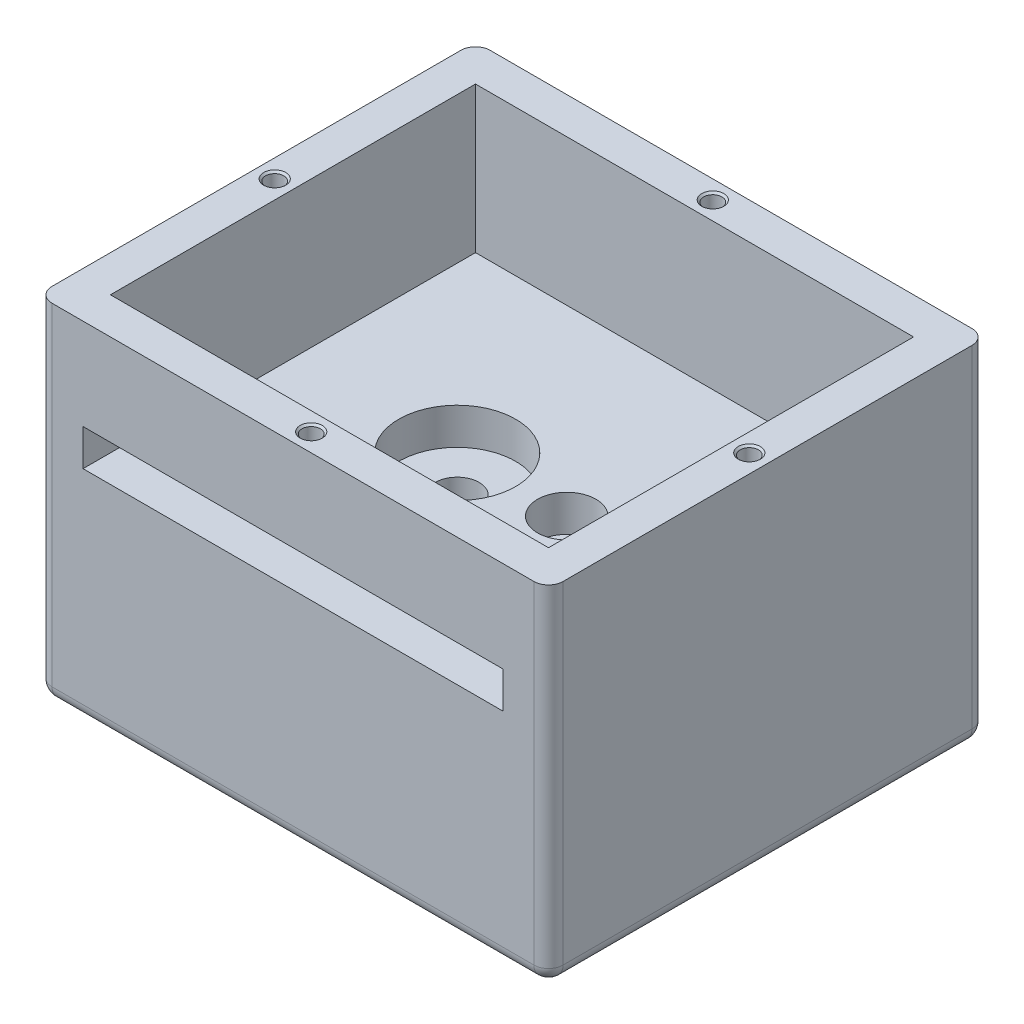
ISO-10303-21;
HEADER;
FILE_DESCRIPTION(('STEP AP214'),'2;1');
FILE_NAME('part.step','',(''),(''),'','','');
FILE_SCHEMA(('AUTOMOTIVE_DESIGN { 1 0 10303 214 1 1 1 1 }'));
ENDSEC;
DATA;
#1=APPLICATION_CONTEXT('core data for automotive mechanical design processes');
#2=APPLICATION_PROTOCOL_DEFINITION('international standard','automotive_design',2000,#1);
#3=PRODUCT_CONTEXT('',#1,'mechanical');
#4=PRODUCT('Part','Part','',(#3));
#5=PRODUCT_RELATED_PRODUCT_CATEGORY('part','',(#4));
#6=PRODUCT_DEFINITION_FORMATION('','',#4);
#7=PRODUCT_DEFINITION_CONTEXT('part definition',#1,'design');
#8=PRODUCT_DEFINITION('design','',#6,#7);
#9=PRODUCT_DEFINITION_SHAPE('','',#8);
#10=(LENGTH_UNIT() NAMED_UNIT(*) SI_UNIT(.MILLI.,.METRE.));
#11=(NAMED_UNIT(*) PLANE_ANGLE_UNIT() SI_UNIT($,.RADIAN.));
#12=(NAMED_UNIT(*) SI_UNIT($,.STERADIAN.) SOLID_ANGLE_UNIT());
#13=UNCERTAINTY_MEASURE_WITH_UNIT(LENGTH_MEASURE(1.E-05),#10,'distance_accuracy_value','');
#14=(GEOMETRIC_REPRESENTATION_CONTEXT(3) GLOBAL_UNCERTAINTY_ASSIGNED_CONTEXT((#13)) GLOBAL_UNIT_ASSIGNED_CONTEXT((#10,
#11,#12)) REPRESENTATION_CONTEXT('',''));
#15=CARTESIAN_POINT('',(0.,0.,0.));
#16=DIRECTION('',(0.,0.,1.));
#17=DIRECTION('',(1.,0.,0.));
#18=AXIS2_PLACEMENT_3D('',#15,#16,#17);
#19=CARTESIAN_POINT('',(0.,40.,0.));
#20=DIRECTION('',(0.,1.,0.));
#21=DIRECTION('',(0.,0.,1.));
#22=AXIS2_PLACEMENT_3D('',#19,#20,#21);
#23=PLANE('',#22);
#24=CARTESIAN_POINT('',(-15.,40.,0.));
#25=DIRECTION('',(0.,1.,0.));
#26=DIRECTION('',(0.,0.,1.));
#27=AXIS2_PLACEMENT_3D('',#24,#25,#26);
#28=CIRCLE('',#27,16.);
#29=CARTESIAN_POINT('',(-15.,40.,16.));
#30=VERTEX_POINT('',#29);
#31=EDGE_CURVE('E227',#30,#30,#28,.T.);
#32=ORIENTED_EDGE('',*,*,#31,.F.);
#33=EDGE_LOOP('',(#32));
#34=FACE_BOUND('',#33,.T.);
#35=CARTESIAN_POINT('',(15.,40.,0.));
#36=DIRECTION('',(0.,1.,0.));
#37=DIRECTION('',(0.,0.,-1.));
#38=AXIS2_PLACEMENT_3D('',#35,#36,#37);
#39=CIRCLE('',#38,8.);
#40=CARTESIAN_POINT('',(15.,40.,-8.));
#41=VERTEX_POINT('',#40);
#42=EDGE_CURVE('E222',#41,#41,#39,.T.);
#43=ORIENTED_EDGE('',*,*,#42,.F.);
#44=EDGE_LOOP('',(#43));
#45=FACE_BOUND('',#44,.T.);
#46=DIRECTION('',(0.,0.,1.));
#47=VECTOR('',#46,1.);
#48=CARTESIAN_POINT('',(-60.,40.,-50.));
#49=LINE('',#48,#47);
#50=CARTESIAN_POINT('',(-60.,40.,-50.));
#51=VERTEX_POINT('',#50);
#52=CARTESIAN_POINT('',(-60.,40.,50.));
#53=VERTEX_POINT('',#52);
#54=EDGE_CURVE('E275',#51,#53,#49,.T.);
#55=ORIENTED_EDGE('',*,*,#54,.T.);
#56=DIRECTION('',(1.,0.,0.));
#57=VECTOR('',#56,1.);
#58=CARTESIAN_POINT('',(-60.,40.,50.));
#59=LINE('',#58,#57);
#60=CARTESIAN_POINT('',(60.,40.,50.));
#61=VERTEX_POINT('',#60);
#62=EDGE_CURVE('E278',#53,#61,#59,.T.);
#63=ORIENTED_EDGE('',*,*,#62,.T.);
#64=DIRECTION('',(0.,0.,-1.));
#65=VECTOR('',#64,1.);
#66=CARTESIAN_POINT('',(60.,40.,-50.));
#67=LINE('',#66,#65);
#68=CARTESIAN_POINT('',(60.,40.,-50.));
#69=VERTEX_POINT('',#68);
#70=EDGE_CURVE('E282',#61,#69,#67,.T.);
#71=ORIENTED_EDGE('',*,*,#70,.T.);
#72=DIRECTION('',(-1.,0.,0.));
#73=VECTOR('',#72,1.);
#74=CARTESIAN_POINT('',(-60.,40.,-50.));
#75=LINE('',#74,#73);
#76=EDGE_CURVE('E285',#69,#51,#75,.T.);
#77=ORIENTED_EDGE('',*,*,#76,.T.);
#78=EDGE_LOOP('',(#55,#63,#71,#77));
#79=FACE_BOUND('',#78,.T.);
#80=ADVANCED_FACE('F43',(#34,#45,#79),#23,.T.);
#81=CARTESIAN_POINT('',(-70.,-15.,60.));
#82=DIRECTION('',(-1.,0.,0.));
#83=DIRECTION('',(0.,0.,1.));
#84=AXIS2_PLACEMENT_3D('',#81,#82,#83);
#85=PLANE('',#84);
#86=DIRECTION('',(0.,0.,1.));
#87=VECTOR('',#86,1.);
#88=CARTESIAN_POINT('',(-70.,80.,60.));
#89=LINE('',#88,#87);
#90=CARTESIAN_POINT('',(-70.,80.,-56.));
#91=VERTEX_POINT('',#90);
#92=CARTESIAN_POINT('',(-70.,80.,56.));
#93=VERTEX_POINT('',#92);
#94=EDGE_CURVE('E300',#91,#93,#89,.T.);
#95=ORIENTED_EDGE('',*,*,#94,.F.);
#96=DIRECTION('',(0.,1.,0.));
#97=VECTOR('',#96,1.);
#98=CARTESIAN_POINT('',(-70.,-15.,-56.));
#99=LINE('',#98,#97);
#100=CARTESIAN_POINT('',(-70.,-11.,-56.));
#101=VERTEX_POINT('',#100);
#102=EDGE_CURVE('E327',#91,#101,#99,.F.);
#103=ORIENTED_EDGE('',*,*,#102,.T.);
#104=DIRECTION('',(0.,0.,1.));
#105=VECTOR('',#104,1.);
#106=CARTESIAN_POINT('',(-70.,-11.,60.));
#107=LINE('',#106,#105);
#108=CARTESIAN_POINT('',(-70.,-11.,56.));
#109=VERTEX_POINT('',#108);
#110=EDGE_CURVE('E324',#101,#109,#107,.T.);
#111=ORIENTED_EDGE('',*,*,#110,.T.);
#112=DIRECTION('',(0.,1.,0.));
#113=VECTOR('',#112,1.);
#114=CARTESIAN_POINT('',(-70.,-15.,56.));
#115=LINE('',#114,#113);
#116=EDGE_CURVE('E318',#109,#93,#115,.T.);
#117=ORIENTED_EDGE('',*,*,#116,.T.);
#118=EDGE_LOOP('',(#95,#103,#111,#117));
#119=FACE_BOUND('',#118,.T.);
#120=ADVANCED_FACE('F428',(#119),#85,.T.);
#121=CARTESIAN_POINT('',(-70.,-15.,-60.));
#122=DIRECTION('',(0.,0.,-1.));
#123=DIRECTION('',(-1.,0.,0.));
#124=AXIS2_PLACEMENT_3D('',#121,#122,#123);
#125=PLANE('',#124);
#126=DIRECTION('',(-1.,0.,0.));
#127=VECTOR('',#126,1.);
#128=CARTESIAN_POINT('',(-70.,-11.,-60.));
#129=LINE('',#128,#127);
#130=CARTESIAN_POINT('',(66.,-11.,-60.));
#131=VERTEX_POINT('',#130);
#132=CARTESIAN_POINT('',(-66.,-11.,-60.));
#133=VERTEX_POINT('',#132);
#134=EDGE_CURVE('E340',#131,#133,#129,.T.);
#135=ORIENTED_EDGE('',*,*,#134,.T.);
#136=DIRECTION('',(0.,1.,0.));
#137=VECTOR('',#136,1.);
#138=CARTESIAN_POINT('',(-66.,-15.,-60.));
#139=LINE('',#138,#137);
#140=CARTESIAN_POINT('',(-66.,80.,-60.));
#141=VERTEX_POINT('',#140);
#142=EDGE_CURVE('E342',#133,#141,#139,.T.);
#143=ORIENTED_EDGE('',*,*,#142,.T.);
#144=DIRECTION('',(-1.,0.,0.));
#145=VECTOR('',#144,1.);
#146=CARTESIAN_POINT('',(-70.,80.,-60.));
#147=LINE('',#146,#145);
#148=CARTESIAN_POINT('',(66.,80.,-60.));
#149=VERTEX_POINT('',#148);
#150=EDGE_CURVE('E315',#149,#141,#147,.T.);
#151=ORIENTED_EDGE('',*,*,#150,.F.);
#152=DIRECTION('',(0.,1.,0.));
#153=VECTOR('',#152,1.);
#154=CARTESIAN_POINT('',(66.,-15.,-60.));
#155=LINE('',#154,#153);
#156=EDGE_CURVE('E338',#149,#131,#155,.F.);
#157=ORIENTED_EDGE('',*,*,#156,.T.);
#158=EDGE_LOOP('',(#135,#143,#151,#157));
#159=FACE_BOUND('',#158,.T.);
#160=ADVANCED_FACE('F479',(#159),#125,.T.);
#161=CARTESIAN_POINT('',(70.,-15.,60.));
#162=DIRECTION('',(1.,0.,0.));
#163=DIRECTION('',(0.,0.,-1.));
#164=AXIS2_PLACEMENT_3D('',#161,#162,#163);
#165=PLANE('',#164);
#166=DIRECTION('',(0.,0.,-1.));
#167=VECTOR('',#166,1.);
#168=CARTESIAN_POINT('',(70.,-11.,60.));
#169=LINE('',#168,#167);
#170=CARTESIAN_POINT('',(70.,-11.,56.));
#171=VERTEX_POINT('',#170);
#172=CARTESIAN_POINT('',(70.,-11.,-56.));
#173=VERTEX_POINT('',#172);
#174=EDGE_CURVE('E60',#171,#173,#169,.T.);
#175=ORIENTED_EDGE('',*,*,#174,.T.);
#176=DIRECTION('',(0.,1.,0.));
#177=VECTOR('',#176,1.);
#178=CARTESIAN_POINT('',(70.,-15.,-56.));
#179=LINE('',#178,#177);
#180=CARTESIAN_POINT('',(70.,80.,-56.));
#181=VERTEX_POINT('',#180);
#182=EDGE_CURVE('E352',#173,#181,#179,.T.);
#183=ORIENTED_EDGE('',*,*,#182,.T.);
#184=DIRECTION('',(0.,0.,-1.));
#185=VECTOR('',#184,1.);
#186=CARTESIAN_POINT('',(70.,80.,60.));
#187=LINE('',#186,#185);
#188=CARTESIAN_POINT('',(70.,80.,56.));
#189=VERTEX_POINT('',#188);
#190=EDGE_CURVE('E312',#189,#181,#187,.T.);
#191=ORIENTED_EDGE('',*,*,#190,.F.);
#192=DIRECTION('',(0.,1.,0.));
#193=VECTOR('',#192,1.);
#194=CARTESIAN_POINT('',(70.,-15.,56.));
#195=LINE('',#194,#193);
#196=EDGE_CURVE('E65',#189,#171,#195,.F.);
#197=ORIENTED_EDGE('',*,*,#196,.T.);
#198=EDGE_LOOP('',(#175,#183,#191,#197));
#199=FACE_BOUND('',#198,.T.);
#200=ADVANCED_FACE('F454',(#199),#165,.T.);
#201=CARTESIAN_POINT('',(-70.,-15.,60.));
#202=DIRECTION('',(0.,0.,1.));
#203=DIRECTION('',(1.,0.,0.));
#204=AXIS2_PLACEMENT_3D('',#201,#202,#203);
#205=PLANE('',#204);
#206=DIRECTION('',(0.,-1.,0.));
#207=VECTOR('',#206,1.);
#208=CARTESIAN_POINT('',(-57.5000000000002,55.,60.));
#209=LINE('',#208,#207);
#210=CARTESIAN_POINT('',(-57.5000000000002,55.,60.));
#211=VERTEX_POINT('',#210);
#212=CARTESIAN_POINT('',(-57.5000000000002,45.,60.));
#213=VERTEX_POINT('',#212);
#214=EDGE_CURVE('E238',#211,#213,#209,.T.);
#215=ORIENTED_EDGE('',*,*,#214,.F.);
#216=DIRECTION('',(-1.,0.,0.));
#217=VECTOR('',#216,1.);
#218=CARTESIAN_POINT('',(-57.5000000000002,55.,60.));
#219=LINE('',#218,#217);
#220=CARTESIAN_POINT('',(57.4999999999998,55.,60.));
#221=VERTEX_POINT('',#220);
#222=EDGE_CURVE('E247',#221,#211,#219,.T.);
#223=ORIENTED_EDGE('',*,*,#222,.F.);
#224=DIRECTION('',(0.,1.,0.));
#225=VECTOR('',#224,1.);
#226=CARTESIAN_POINT('',(57.4999999999998,55.,60.));
#227=LINE('',#226,#225);
#228=CARTESIAN_POINT('',(57.4999999999998,45.,60.));
#229=VERTEX_POINT('',#228);
#230=EDGE_CURVE('E261',#229,#221,#227,.T.);
#231=ORIENTED_EDGE('',*,*,#230,.F.);
#232=DIRECTION('',(1.,0.,0.));
#233=VECTOR('',#232,1.);
#234=CARTESIAN_POINT('',(-57.5000000000002,45.,60.));
#235=LINE('',#234,#233);
#236=EDGE_CURVE('E258',#213,#229,#235,.T.);
#237=ORIENTED_EDGE('',*,*,#236,.F.);
#238=EDGE_LOOP('',(#215,#223,#231,#237));
#239=FACE_BOUND('',#238,.T.);
#240=DIRECTION('',(1.,0.,0.));
#241=VECTOR('',#240,1.);
#242=CARTESIAN_POINT('',(-70.,-11.,60.));
#243=LINE('',#242,#241);
#244=CARTESIAN_POINT('',(-66.,-11.,60.));
#245=VERTEX_POINT('',#244);
#246=CARTESIAN_POINT('',(66.,-11.,60.));
#247=VERTEX_POINT('',#246);
#248=EDGE_CURVE('E346',#245,#247,#243,.T.);
#249=ORIENTED_EDGE('',*,*,#248,.T.);
#250=DIRECTION('',(0.,1.,0.));
#251=VECTOR('',#250,1.);
#252=CARTESIAN_POINT('',(66.,-15.,60.));
#253=LINE('',#252,#251);
#254=CARTESIAN_POINT('',(66.,80.,60.));
#255=VERTEX_POINT('',#254);
#256=EDGE_CURVE('E348',#247,#255,#253,.T.);
#257=ORIENTED_EDGE('',*,*,#256,.T.);
#258=DIRECTION('',(1.,0.,0.));
#259=VECTOR('',#258,1.);
#260=CARTESIAN_POINT('',(-70.,80.,60.));
#261=LINE('',#260,#259);
#262=CARTESIAN_POINT('',(-66.,80.,60.));
#263=VERTEX_POINT('',#262);
#264=EDGE_CURVE('E309',#263,#255,#261,.T.);
#265=ORIENTED_EDGE('',*,*,#264,.F.);
#266=DIRECTION('',(0.,1.,0.));
#267=VECTOR('',#266,1.);
#268=CARTESIAN_POINT('',(-66.,-15.,60.));
#269=LINE('',#268,#267);
#270=EDGE_CURVE('E344',#263,#245,#269,.F.);
#271=ORIENTED_EDGE('',*,*,#270,.T.);
#272=EDGE_LOOP('',(#249,#257,#265,#271));
#273=FACE_BOUND('',#272,.T.);
#274=ADVANCED_FACE('F439',(#239,#273),#205,.T.);
#275=CARTESIAN_POINT('',(0.,-15.,0.));
#276=DIRECTION('',(0.,-1.,0.));
#277=DIRECTION('',(0.,0.,-1.));
#278=AXIS2_PLACEMENT_3D('',#275,#276,#277);
#279=PLANE('',#278);
#280=DIRECTION('',(1.,0.,0.));
#281=VECTOR('',#280,1.);
#282=CARTESIAN_POINT('',(0.,-15.,56.));
#283=LINE('',#282,#281);
#284=CARTESIAN_POINT('',(66.,-15.,56.));
#285=VERTEX_POINT('',#284);
#286=CARTESIAN_POINT('',(-66.,-15.,56.));
#287=VERTEX_POINT('',#286);
#288=EDGE_CURVE('E331',#285,#287,#283,.F.);
#289=ORIENTED_EDGE('',*,*,#288,.T.);
#290=DIRECTION('',(0.,0.,1.));
#291=VECTOR('',#290,1.);
#292=CARTESIAN_POINT('',(-66.,-15.,0.));
#293=LINE('',#292,#291);
#294=CARTESIAN_POINT('',(-66.,-15.,-56.));
#295=VERTEX_POINT('',#294);
#296=EDGE_CURVE('E335',#287,#295,#293,.F.);
#297=ORIENTED_EDGE('',*,*,#296,.T.);
#298=DIRECTION('',(-1.,0.,0.));
#299=VECTOR('',#298,1.);
#300=CARTESIAN_POINT('',(0.,-15.,-56.));
#301=LINE('',#300,#299);
#302=CARTESIAN_POINT('',(66.,-15.,-56.));
#303=VERTEX_POINT('',#302);
#304=EDGE_CURVE('E333',#295,#303,#301,.F.);
#305=ORIENTED_EDGE('',*,*,#304,.T.);
#306=DIRECTION('',(0.,0.,-1.));
#307=VECTOR('',#306,1.);
#308=CARTESIAN_POINT('',(66.,-15.,0.));
#309=LINE('',#308,#307);
#310=EDGE_CURVE('E329',#303,#285,#309,.F.);
#311=ORIENTED_EDGE('',*,*,#310,.T.);
#312=EDGE_LOOP('',(#289,#297,#305,#311));
#313=FACE_BOUND('',#312,.T.);
#314=ADVANCED_FACE('F402',(#313),#279,.T.);
#315=CARTESIAN_POINT('',(0.,80.,0.));
#316=DIRECTION('',(0.,-1.,0.));
#317=DIRECTION('',(0.,0.,-1.));
#318=AXIS2_PLACEMENT_3D('',#315,#316,#317);
#319=PLANE('',#318);
#320=CARTESIAN_POINT('',(65.,80.,0.));
#321=DIRECTION('',(0.,1.,0.));
#322=DIRECTION('',(0.,0.,1.));
#323=AXIS2_PLACEMENT_3D('',#320,#321,#322);
#324=CIRCLE('',#323,3.025);
#325=CARTESIAN_POINT('',(65.,80.,3.025));
#326=VERTEX_POINT('',#325);
#327=EDGE_CURVE('E195',#326,#326,#324,.T.);
#328=ORIENTED_EDGE('',*,*,#327,.F.);
#329=EDGE_LOOP('',(#328));
#330=FACE_BOUND('',#329,.T.);
#331=CARTESIAN_POINT('',(0.,80.,55.));
#332=DIRECTION('',(0.,1.,0.));
#333=DIRECTION('',(0.,0.,1.));
#334=AXIS2_PLACEMENT_3D('',#331,#332,#333);
#335=CIRCLE('',#334,3.025);
#336=CARTESIAN_POINT('',(0.,80.,58.025));
#337=VERTEX_POINT('',#336);
#338=EDGE_CURVE('E188',#337,#337,#335,.T.);
#339=ORIENTED_EDGE('',*,*,#338,.F.);
#340=EDGE_LOOP('',(#339));
#341=FACE_BOUND('',#340,.T.);
#342=CARTESIAN_POINT('',(0.,80.,-55.));
#343=DIRECTION('',(0.,1.,0.));
#344=DIRECTION('',(0.,0.,1.));
#345=AXIS2_PLACEMENT_3D('',#342,#343,#344);
#346=CIRCLE('',#345,3.025);
#347=CARTESIAN_POINT('',(0.,80.,-51.975));
#348=VERTEX_POINT('',#347);
#349=EDGE_CURVE('E204',#348,#348,#346,.T.);
#350=ORIENTED_EDGE('',*,*,#349,.F.);
#351=EDGE_LOOP('',(#350));
#352=FACE_BOUND('',#351,.T.);
#353=CARTESIAN_POINT('',(-65.,80.,0.));
#354=DIRECTION('',(0.,1.,0.));
#355=DIRECTION('',(0.,0.,1.));
#356=AXIS2_PLACEMENT_3D('',#353,#354,#355);
#357=CIRCLE('',#356,3.025);
#358=CARTESIAN_POINT('',(-65.,80.,3.025));
#359=VERTEX_POINT('',#358);
#360=EDGE_CURVE('E213',#359,#359,#357,.T.);
#361=ORIENTED_EDGE('',*,*,#360,.F.);
#362=EDGE_LOOP('',(#361));
#363=FACE_BOUND('',#362,.T.);
#364=DIRECTION('',(1.,0.,0.));
#365=VECTOR('',#364,1.);
#366=CARTESIAN_POINT('',(-60.,80.,50.));
#367=LINE('',#366,#365);
#368=CARTESIAN_POINT('',(-60.,80.,50.));
#369=VERTEX_POINT('',#368);
#370=CARTESIAN_POINT('',(60.,80.,50.));
#371=VERTEX_POINT('',#370);
#372=EDGE_CURVE('E290',#369,#371,#367,.T.);
#373=ORIENTED_EDGE('',*,*,#372,.F.);
#374=DIRECTION('',(0.,0.,1.));
#375=VECTOR('',#374,1.);
#376=CARTESIAN_POINT('',(-60.,80.,-50.));
#377=LINE('',#376,#375);
#378=CARTESIAN_POINT('',(-60.,80.,-50.));
#379=VERTEX_POINT('',#378);
#380=EDGE_CURVE('E268',#379,#369,#377,.T.);
#381=ORIENTED_EDGE('',*,*,#380,.F.);
#382=DIRECTION('',(-1.,0.,0.));
#383=VECTOR('',#382,1.);
#384=CARTESIAN_POINT('',(-60.,80.,-50.));
#385=LINE('',#384,#383);
#386=CARTESIAN_POINT('',(60.,80.,-50.));
#387=VERTEX_POINT('',#386);
#388=EDGE_CURVE('E279',#387,#379,#385,.T.);
#389=ORIENTED_EDGE('',*,*,#388,.F.);
#390=DIRECTION('',(0.,0.,-1.));
#391=VECTOR('',#390,1.);
#392=CARTESIAN_POINT('',(60.,80.,-50.));
#393=LINE('',#392,#391);
#394=EDGE_CURVE('E293',#371,#387,#393,.T.);
#395=ORIENTED_EDGE('',*,*,#394,.F.);
#396=EDGE_LOOP('',(#373,#381,#389,#395));
#397=FACE_BOUND('',#396,.T.);
#398=ORIENTED_EDGE('',*,*,#150,.T.);
#399=CARTESIAN_POINT('',(-66.,80.,-56.));
#400=DIRECTION('',(0.,-1.,0.));
#401=DIRECTION('',(0.,0.,-1.));
#402=AXIS2_PLACEMENT_3D('',#399,#400,#401);
#403=CIRCLE('',#402,4.);
#404=EDGE_CURVE('E11',#141,#91,#403,.F.);
#405=ORIENTED_EDGE('',*,*,#404,.T.);
#406=ORIENTED_EDGE('',*,*,#94,.T.);
#407=CARTESIAN_POINT('',(-66.,80.,56.));
#408=DIRECTION('',(0.,-1.,0.));
#409=DIRECTION('',(0.,0.,-1.));
#410=AXIS2_PLACEMENT_3D('',#407,#408,#409);
#411=CIRCLE('',#410,4.);
#412=EDGE_CURVE('E354',#93,#263,#411,.F.);
#413=ORIENTED_EDGE('',*,*,#412,.T.);
#414=ORIENTED_EDGE('',*,*,#264,.T.);
#415=CARTESIAN_POINT('',(66.,80.,56.));
#416=DIRECTION('',(0.,-1.,0.));
#417=DIRECTION('',(0.,0.,-1.));
#418=AXIS2_PLACEMENT_3D('',#415,#416,#417);
#419=CIRCLE('',#418,4.);
#420=EDGE_CURVE('E356',#255,#189,#419,.F.);
#421=ORIENTED_EDGE('',*,*,#420,.T.);
#422=ORIENTED_EDGE('',*,*,#190,.T.);
#423=CARTESIAN_POINT('',(66.,80.,-56.));
#424=DIRECTION('',(0.,-1.,0.));
#425=DIRECTION('',(0.,0.,-1.));
#426=AXIS2_PLACEMENT_3D('',#423,#424,#425);
#427=CIRCLE('',#426,4.);
#428=EDGE_CURVE('E52',#181,#149,#427,.F.);
#429=ORIENTED_EDGE('',*,*,#428,.T.);
#430=EDGE_LOOP('',(#398,#405,#406,#413,#414,#421,#422,#429));
#431=FACE_BOUND('',#430,.T.);
#432=ADVANCED_FACE('F398',(#330,#341,#352,#363,#397,#431),#319,.F.);
#433=CARTESIAN_POINT('',(-60.,40.,-50.));
#434=DIRECTION('',(-1.,0.,0.));
#435=DIRECTION('',(0.,0.,1.));
#436=AXIS2_PLACEMENT_3D('',#433,#434,#435);
#437=PLANE('',#436);
#438=ORIENTED_EDGE('',*,*,#380,.T.);
#439=DIRECTION('',(0.,1.,0.));
#440=VECTOR('',#439,1.);
#441=CARTESIAN_POINT('',(-60.,40.,50.));
#442=LINE('',#441,#440);
#443=EDGE_CURVE('E288',#53,#369,#442,.T.);
#444=ORIENTED_EDGE('',*,*,#443,.F.);
#445=ORIENTED_EDGE('',*,*,#54,.F.);
#446=DIRECTION('',(0.,1.,0.));
#447=VECTOR('',#446,1.);
#448=CARTESIAN_POINT('',(-60.,40.,-50.));
#449=LINE('',#448,#447);
#450=EDGE_CURVE('E298',#51,#379,#449,.T.);
#451=ORIENTED_EDGE('',*,*,#450,.T.);
#452=EDGE_LOOP('',(#438,#444,#445,#451));
#453=FACE_BOUND('',#452,.T.);
#454=ADVANCED_FACE('F401',(#453),#437,.F.);
#455=CARTESIAN_POINT('',(-60.,40.,-50.));
#456=DIRECTION('',(0.,0.,-1.));
#457=DIRECTION('',(-1.,0.,0.));
#458=AXIS2_PLACEMENT_3D('',#455,#456,#457);
#459=PLANE('',#458);
#460=ORIENTED_EDGE('',*,*,#388,.T.);
#461=ORIENTED_EDGE('',*,*,#450,.F.);
#462=ORIENTED_EDGE('',*,*,#76,.F.);
#463=DIRECTION('',(0.,1.,0.));
#464=VECTOR('',#463,1.);
#465=CARTESIAN_POINT('',(60.,40.,-50.));
#466=LINE('',#465,#464);
#467=EDGE_CURVE('E301',#69,#387,#466,.T.);
#468=ORIENTED_EDGE('',*,*,#467,.T.);
#469=EDGE_LOOP('',(#460,#461,#462,#468));
#470=FACE_BOUND('',#469,.T.);
#471=ADVANCED_FACE('F487',(#470),#459,.F.);
#472=CARTESIAN_POINT('',(60.,40.,-50.));
#473=DIRECTION('',(1.,0.,0.));
#474=DIRECTION('',(0.,0.,-1.));
#475=AXIS2_PLACEMENT_3D('',#472,#473,#474);
#476=PLANE('',#475);
#477=ORIENTED_EDGE('',*,*,#394,.T.);
#478=ORIENTED_EDGE('',*,*,#467,.F.);
#479=ORIENTED_EDGE('',*,*,#70,.F.);
#480=DIRECTION('',(0.,1.,0.));
#481=VECTOR('',#480,1.);
#482=CARTESIAN_POINT('',(60.,40.,50.));
#483=LINE('',#482,#481);
#484=EDGE_CURVE('E303',#61,#371,#483,.T.);
#485=ORIENTED_EDGE('',*,*,#484,.T.);
#486=EDGE_LOOP('',(#477,#478,#479,#485));
#487=FACE_BOUND('',#486,.T.);
#488=ADVANCED_FACE('F490',(#487),#476,.F.);
#489=CARTESIAN_POINT('',(-60.,40.,50.));
#490=DIRECTION('',(0.,0.,1.));
#491=DIRECTION('',(1.,0.,0.));
#492=AXIS2_PLACEMENT_3D('',#489,#490,#491);
#493=PLANE('',#492);
#494=DIRECTION('',(-1.,0.,0.));
#495=VECTOR('',#494,1.);
#496=CARTESIAN_POINT('',(-57.5000000000002,55.,50.));
#497=LINE('',#496,#495);
#498=CARTESIAN_POINT('',(57.4999999999998,55.,50.));
#499=VERTEX_POINT('',#498);
#500=CARTESIAN_POINT('',(-57.5000000000002,55.,50.));
#501=VERTEX_POINT('',#500);
#502=EDGE_CURVE('E253',#499,#501,#497,.T.);
#503=ORIENTED_EDGE('',*,*,#502,.T.);
#504=DIRECTION('',(0.,-1.,0.));
#505=VECTOR('',#504,1.);
#506=CARTESIAN_POINT('',(-57.5000000000002,55.,50.));
#507=LINE('',#506,#505);
#508=CARTESIAN_POINT('',(-57.5000000000002,45.,50.));
#509=VERTEX_POINT('',#508);
#510=EDGE_CURVE('E243',#501,#509,#507,.T.);
#511=ORIENTED_EDGE('',*,*,#510,.T.);
#512=DIRECTION('',(1.,0.,0.));
#513=VECTOR('',#512,1.);
#514=CARTESIAN_POINT('',(-57.5000000000002,45.,50.));
#515=LINE('',#514,#513);
#516=CARTESIAN_POINT('',(57.4999999999998,45.,50.));
#517=VERTEX_POINT('',#516);
#518=EDGE_CURVE('E246',#509,#517,#515,.T.);
#519=ORIENTED_EDGE('',*,*,#518,.T.);
#520=DIRECTION('',(0.,1.,0.));
#521=VECTOR('',#520,1.);
#522=CARTESIAN_POINT('',(57.4999999999998,55.,50.));
#523=LINE('',#522,#521);
#524=EDGE_CURVE('E250',#517,#499,#523,.T.);
#525=ORIENTED_EDGE('',*,*,#524,.T.);
#526=EDGE_LOOP('',(#503,#511,#519,#525));
#527=FACE_BOUND('',#526,.T.);
#528=ORIENTED_EDGE('',*,*,#372,.T.);
#529=ORIENTED_EDGE('',*,*,#484,.F.);
#530=ORIENTED_EDGE('',*,*,#62,.F.);
#531=ORIENTED_EDGE('',*,*,#443,.T.);
#532=EDGE_LOOP('',(#528,#529,#530,#531));
#533=FACE_BOUND('',#532,.T.);
#534=ADVANCED_FACE('F494',(#527,#533),#493,.F.);
#535=CARTESIAN_POINT('',(-57.5000000000002,55.,50.));
#536=DIRECTION('',(-1.,0.,0.));
#537=DIRECTION('',(0.,0.,1.));
#538=AXIS2_PLACEMENT_3D('',#535,#536,#537);
#539=PLANE('',#538);
#540=ORIENTED_EDGE('',*,*,#214,.T.);
#541=DIRECTION('',(0.,0.,1.));
#542=VECTOR('',#541,1.);
#543=CARTESIAN_POINT('',(-57.5000000000002,45.,50.));
#544=LINE('',#543,#542);
#545=EDGE_CURVE('E256',#509,#213,#544,.T.);
#546=ORIENTED_EDGE('',*,*,#545,.F.);
#547=ORIENTED_EDGE('',*,*,#510,.F.);
#548=DIRECTION('',(0.,0.,1.));
#549=VECTOR('',#548,1.);
#550=CARTESIAN_POINT('',(-57.5000000000002,55.,50.));
#551=LINE('',#550,#549);
#552=EDGE_CURVE('E266',#501,#211,#551,.T.);
#553=ORIENTED_EDGE('',*,*,#552,.T.);
#554=EDGE_LOOP('',(#540,#546,#547,#553));
#555=FACE_BOUND('',#554,.T.);
#556=ADVANCED_FACE('F485',(#555),#539,.F.);
#557=CARTESIAN_POINT('',(-57.5000000000002,55.,50.));
#558=DIRECTION('',(0.,1.,0.));
#559=DIRECTION('',(0.,0.,1.));
#560=AXIS2_PLACEMENT_3D('',#557,#558,#559);
#561=PLANE('',#560);
#562=ORIENTED_EDGE('',*,*,#222,.T.);
#563=ORIENTED_EDGE('',*,*,#552,.F.);
#564=ORIENTED_EDGE('',*,*,#502,.F.);
#565=DIRECTION('',(0.,0.,1.));
#566=VECTOR('',#565,1.);
#567=CARTESIAN_POINT('',(57.4999999999998,55.,50.));
#568=LINE('',#567,#566);
#569=EDGE_CURVE('E269',#499,#221,#568,.T.);
#570=ORIENTED_EDGE('',*,*,#569,.T.);
#571=EDGE_LOOP('',(#562,#563,#564,#570));
#572=FACE_BOUND('',#571,.T.);
#573=ADVANCED_FACE('F863',(#572),#561,.F.);
#574=CARTESIAN_POINT('',(57.4999999999998,55.,50.));
#575=DIRECTION('',(1.,0.,0.));
#576=DIRECTION('',(0.,0.,-1.));
#577=AXIS2_PLACEMENT_3D('',#574,#575,#576);
#578=PLANE('',#577);
#579=ORIENTED_EDGE('',*,*,#230,.T.);
#580=ORIENTED_EDGE('',*,*,#569,.F.);
#581=ORIENTED_EDGE('',*,*,#524,.F.);
#582=DIRECTION('',(0.,0.,1.));
#583=VECTOR('',#582,1.);
#584=CARTESIAN_POINT('',(57.4999999999998,45.,50.));
#585=LINE('',#584,#583);
#586=EDGE_CURVE('E271',#517,#229,#585,.T.);
#587=ORIENTED_EDGE('',*,*,#586,.T.);
#588=EDGE_LOOP('',(#579,#580,#581,#587));
#589=FACE_BOUND('',#588,.T.);
#590=ADVANCED_FACE('F853',(#589),#578,.F.);
#591=CARTESIAN_POINT('',(-57.5000000000002,45.,50.));
#592=DIRECTION('',(0.,-1.,0.));
#593=DIRECTION('',(0.,0.,-1.));
#594=AXIS2_PLACEMENT_3D('',#591,#592,#593);
#595=PLANE('',#594);
#596=ORIENTED_EDGE('',*,*,#236,.T.);
#597=ORIENTED_EDGE('',*,*,#586,.F.);
#598=ORIENTED_EDGE('',*,*,#518,.F.);
#599=ORIENTED_EDGE('',*,*,#545,.T.);
#600=EDGE_LOOP('',(#596,#597,#598,#599));
#601=FACE_BOUND('',#600,.T.);
#602=ADVANCED_FACE('F798',(#601),#595,.F.);
#603=CARTESIAN_POINT('',(15.,30.,0.));
#604=DIRECTION('',(0.,-1.,0.));
#605=DIRECTION('',(0.,0.,-1.));
#606=AXIS2_PLACEMENT_3D('',#603,#604,#605);
#607=PLANE('',#606);
#608=CARTESIAN_POINT('',(15.,30.,0.));
#609=DIRECTION('',(0.,1.,0.));
#610=DIRECTION('',(0.,0.,-1.));
#611=AXIS2_PLACEMENT_3D('',#608,#609,#610);
#612=CIRCLE('',#611,8.);
#613=CARTESIAN_POINT('',(15.,30.,-8.));
#614=VERTEX_POINT('',#613);
#615=EDGE_CURVE('E230',#614,#614,#612,.T.);
#616=ORIENTED_EDGE('',*,*,#615,.T.);
#617=EDGE_LOOP('',(#616));
#618=FACE_BOUND('',#617,.T.);
#619=CARTESIAN_POINT('',(15.,30.,0.));
#620=DIRECTION('',(0.,-1.,0.));
#621=DIRECTION('',(0.,0.,-1.));
#622=AXIS2_PLACEMENT_3D('',#619,#620,#621);
#623=CIRCLE('',#622,6.);
#624=CARTESIAN_POINT('',(15.,30.,-6.));
#625=VERTEX_POINT('',#624);
#626=EDGE_CURVE('E226',#625,#625,#623,.F.);
#627=ORIENTED_EDGE('',*,*,#626,.F.);
#628=EDGE_LOOP('',(#627));
#629=FACE_BOUND('',#628,.T.);
#630=ADVANCED_FACE('F787',(#618,#629),#607,.F.);
#631=CARTESIAN_POINT('',(15.,30.,0.));
#632=DIRECTION('',(0.,1.,0.));
#633=DIRECTION('',(0.,0.,1.));
#634=AXIS2_PLACEMENT_3D('',#631,#632,#633);
#635=CYLINDRICAL_SURFACE('',#634,8.);
#636=ORIENTED_EDGE('',*,*,#615,.F.);
#637=EDGE_LOOP('',(#636));
#638=FACE_BOUND('',#637,.T.);
#639=ORIENTED_EDGE('',*,*,#42,.T.);
#640=EDGE_LOOP('',(#639));
#641=FACE_BOUND('',#640,.T.);
#642=ADVANCED_FACE('F776',(#638,#641),#635,.F.);
#643=CARTESIAN_POINT('',(-15.,30.,0.));
#644=DIRECTION('',(0.,1.,0.));
#645=DIRECTION('',(0.,0.,1.));
#646=AXIS2_PLACEMENT_3D('',#643,#644,#645);
#647=CYLINDRICAL_SURFACE('',#646,16.);
#648=CARTESIAN_POINT('',(-15.,30.,0.));
#649=DIRECTION('',(0.,1.,0.));
#650=DIRECTION('',(0.,0.,1.));
#651=AXIS2_PLACEMENT_3D('',#648,#649,#650);
#652=CIRCLE('',#651,16.);
#653=CARTESIAN_POINT('',(-15.,30.,16.));
#654=VERTEX_POINT('',#653);
#655=EDGE_CURVE('E223',#654,#654,#652,.T.);
#656=ORIENTED_EDGE('',*,*,#655,.F.);
#657=EDGE_LOOP('',(#656));
#658=FACE_BOUND('',#657,.T.);
#659=ORIENTED_EDGE('',*,*,#31,.T.);
#660=EDGE_LOOP('',(#659));
#661=FACE_BOUND('',#660,.T.);
#662=ADVANCED_FACE('F764',(#658,#661),#647,.F.);
#663=CARTESIAN_POINT('',(-15.,30.,0.));
#664=DIRECTION('',(0.,1.,0.));
#665=DIRECTION('',(0.,0.,1.));
#666=AXIS2_PLACEMENT_3D('',#663,#664,#665);
#667=PLANE('',#666);
#668=CARTESIAN_POINT('',(-15.,30.,0.));
#669=DIRECTION('',(0.,1.,0.));
#670=DIRECTION('',(0.,0.,1.));
#671=AXIS2_PLACEMENT_3D('',#668,#669,#670);
#672=CIRCLE('',#671,6.);
#673=CARTESIAN_POINT('',(-15.,30.,6.));
#674=VERTEX_POINT('',#673);
#675=EDGE_CURVE('E242',#674,#674,#672,.T.);
#676=ORIENTED_EDGE('',*,*,#675,.F.);
#677=EDGE_LOOP('',(#676));
#678=FACE_BOUND('',#677,.T.);
#679=ORIENTED_EDGE('',*,*,#655,.T.);
#680=EDGE_LOOP('',(#679));
#681=FACE_BOUND('',#680,.T.);
#682=ADVANCED_FACE('F757',(#678,#681),#667,.T.);
#683=CARTESIAN_POINT('',(15.,0.,0.));
#684=DIRECTION('',(0.,1.,0.));
#685=DIRECTION('',(0.,0.,1.));
#686=AXIS2_PLACEMENT_3D('',#683,#684,#685);
#687=PLANE('',#686);
#688=CARTESIAN_POINT('',(15.,0.,0.));
#689=DIRECTION('',(0.,1.,0.));
#690=DIRECTION('',(0.,0.,1.));
#691=AXIS2_PLACEMENT_3D('',#688,#689,#690);
#692=CIRCLE('',#691,6.);
#693=CARTESIAN_POINT('',(15.,0.,6.));
#694=VERTEX_POINT('',#693);
#695=EDGE_CURVE('E235',#694,#694,#692,.T.);
#696=ORIENTED_EDGE('',*,*,#695,.T.);
#697=EDGE_LOOP('',(#696));
#698=FACE_BOUND('',#697,.T.);
#699=ADVANCED_FACE('F763',(#698),#687,.T.);
#700=CARTESIAN_POINT('',(15.,0.,0.));
#701=DIRECTION('',(0.,1.,0.));
#702=DIRECTION('',(0.,0.,1.));
#703=AXIS2_PLACEMENT_3D('',#700,#701,#702);
#704=CYLINDRICAL_SURFACE('',#703,6.);
#705=ORIENTED_EDGE('',*,*,#626,.T.);
#706=EDGE_LOOP('',(#705));
#707=FACE_BOUND('',#706,.T.);
#708=ORIENTED_EDGE('',*,*,#695,.F.);
#709=EDGE_LOOP('',(#708));
#710=FACE_BOUND('',#709,.T.);
#711=ADVANCED_FACE('F818',(#707,#710),#704,.F.);
#712=CARTESIAN_POINT('',(-15.,0.,0.));
#713=DIRECTION('',(0.,-1.,0.));
#714=DIRECTION('',(0.,0.,-1.));
#715=AXIS2_PLACEMENT_3D('',#712,#713,#714);
#716=PLANE('',#715);
#717=CARTESIAN_POINT('',(-15.,0.,0.));
#718=DIRECTION('',(0.,-1.,0.));
#719=DIRECTION('',(0.,0.,-1.));
#720=AXIS2_PLACEMENT_3D('',#717,#718,#719);
#721=CIRCLE('',#720,6.);
#722=CARTESIAN_POINT('',(-15.,0.,-6.));
#723=VERTEX_POINT('',#722);
#724=EDGE_CURVE('E239',#723,#723,#721,.T.);
#725=ORIENTED_EDGE('',*,*,#724,.F.);
#726=EDGE_LOOP('',(#725));
#727=FACE_BOUND('',#726,.T.);
#728=ADVANCED_FACE('F808',(#727),#716,.F.);
#729=CARTESIAN_POINT('',(-15.,0.,0.));
#730=DIRECTION('',(0.,1.,0.));
#731=DIRECTION('',(0.,0.,1.));
#732=AXIS2_PLACEMENT_3D('',#729,#730,#731);
#733=CYLINDRICAL_SURFACE('',#732,6.);
#734=ORIENTED_EDGE('',*,*,#724,.T.);
#735=EDGE_LOOP('',(#734));
#736=FACE_BOUND('',#735,.T.);
#737=ORIENTED_EDGE('',*,*,#675,.T.);
#738=EDGE_LOOP('',(#737));
#739=FACE_BOUND('',#738,.T.);
#740=ADVANCED_FACE('F750',(#736,#739),#733,.F.);
#741=CARTESIAN_POINT('',(-65.,67.,0.));
#742=DIRECTION('',(0.,1.,0.));
#743=DIRECTION('',(0.,0.,1.));
#744=AXIS2_PLACEMENT_3D('',#741,#742,#743);
#745=CONICAL_SURFACE('',#744,2.5,1.02974425867666);
#746=CARTESIAN_POINT('',(-65.,65.4978484524311,0.));
#747=VERTEX_POINT('',#746);
#748=VERTEX_LOOP('',#747);
#749=FACE_BOUND('',#748,.T.);
#750=CARTESIAN_POINT('',(-65.,67.,0.));
#751=DIRECTION('',(0.,1.,0.));
#752=DIRECTION('',(0.,0.,1.));
#753=AXIS2_PLACEMENT_3D('',#750,#751,#752);
#754=CIRCLE('',#753,2.5);
#755=CARTESIAN_POINT('',(-65.,67.,2.5));
#756=VERTEX_POINT('',#755);
#757=EDGE_CURVE('E219',#756,#756,#754,.T.);
#758=ORIENTED_EDGE('',*,*,#757,.T.);
#759=EDGE_LOOP('',(#758));
#760=FACE_BOUND('',#759,.T.);
#761=ADVANCED_FACE('F738',(#749,#760),#745,.F.);
#762=CARTESIAN_POINT('',(-65.,80.,0.));
#763=DIRECTION('',(0.,1.,0.));
#764=DIRECTION('',(0.,0.,1.));
#765=AXIS2_PLACEMENT_3D('',#762,#763,#764);
#766=CYLINDRICAL_SURFACE('',#765,2.5);
#767=ORIENTED_EDGE('',*,*,#757,.F.);
#768=EDGE_LOOP('',(#767));
#769=FACE_BOUND('',#768,.T.);
#770=CARTESIAN_POINT('',(-65.,79.475,0.));
#771=DIRECTION('',(0.,1.,0.));
#772=DIRECTION('',(0.,0.,1.));
#773=AXIS2_PLACEMENT_3D('',#770,#771,#772);
#774=CIRCLE('',#773,2.5);
#775=CARTESIAN_POINT('',(-65.,79.475,2.5));
#776=VERTEX_POINT('',#775);
#777=EDGE_CURVE('E216',#776,#776,#774,.T.);
#778=ORIENTED_EDGE('',*,*,#777,.T.);
#779=EDGE_LOOP('',(#778));
#780=FACE_BOUND('',#779,.T.);
#781=ADVANCED_FACE('F727',(#769,#780),#766,.F.);
#782=CARTESIAN_POINT('',(-65.,80.,0.));
#783=DIRECTION('',(0.,1.,0.));
#784=DIRECTION('',(0.,0.,1.));
#785=AXIS2_PLACEMENT_3D('',#782,#783,#784);
#786=CONICAL_SURFACE('',#785,3.025,0.785398163397448);
#787=ORIENTED_EDGE('',*,*,#777,.F.);
#788=EDGE_LOOP('',(#787));
#789=FACE_BOUND('',#788,.T.);
#790=ORIENTED_EDGE('',*,*,#360,.T.);
#791=EDGE_LOOP('',(#790));
#792=FACE_BOUND('',#791,.T.);
#793=ADVANCED_FACE('F716',(#789,#792),#786,.F.);
#794=CARTESIAN_POINT('',(0.,67.,-55.));
#795=DIRECTION('',(0.,1.,0.));
#796=DIRECTION('',(0.,0.,1.));
#797=AXIS2_PLACEMENT_3D('',#794,#795,#796);
#798=CONICAL_SURFACE('',#797,2.5,1.02974425867665);
#799=CARTESIAN_POINT('',(0.,65.4978484524311,-55.));
#800=VERTEX_POINT('',#799);
#801=VERTEX_LOOP('',#800);
#802=FACE_BOUND('',#801,.T.);
#803=CARTESIAN_POINT('',(0.,67.,-55.));
#804=DIRECTION('',(0.,1.,0.));
#805=DIRECTION('',(0.,0.,1.));
#806=AXIS2_PLACEMENT_3D('',#803,#804,#805);
#807=CIRCLE('',#806,2.5);
#808=CARTESIAN_POINT('',(0.,67.,-52.5));
#809=VERTEX_POINT('',#808);
#810=EDGE_CURVE('E210',#809,#809,#807,.T.);
#811=ORIENTED_EDGE('',*,*,#810,.T.);
#812=EDGE_LOOP('',(#811));
#813=FACE_BOUND('',#812,.T.);
#814=ADVANCED_FACE('F704',(#802,#813),#798,.F.);
#815=CARTESIAN_POINT('',(0.,80.,-55.));
#816=DIRECTION('',(0.,1.,0.));
#817=DIRECTION('',(0.,0.,1.));
#818=AXIS2_PLACEMENT_3D('',#815,#816,#817);
#819=CYLINDRICAL_SURFACE('',#818,2.5);
#820=ORIENTED_EDGE('',*,*,#810,.F.);
#821=EDGE_LOOP('',(#820));
#822=FACE_BOUND('',#821,.T.);
#823=CARTESIAN_POINT('',(0.,79.475,-55.));
#824=DIRECTION('',(0.,1.,0.));
#825=DIRECTION('',(0.,0.,1.));
#826=AXIS2_PLACEMENT_3D('',#823,#824,#825);
#827=CIRCLE('',#826,2.5);
#828=CARTESIAN_POINT('',(0.,79.475,-52.5));
#829=VERTEX_POINT('',#828);
#830=EDGE_CURVE('E207',#829,#829,#827,.T.);
#831=ORIENTED_EDGE('',*,*,#830,.T.);
#832=EDGE_LOOP('',(#831));
#833=FACE_BOUND('',#832,.T.);
#834=ADVANCED_FACE('F693',(#822,#833),#819,.F.);
#835=CARTESIAN_POINT('',(0.,80.,-55.));
#836=DIRECTION('',(0.,1.,0.));
#837=DIRECTION('',(0.,0.,1.));
#838=AXIS2_PLACEMENT_3D('',#835,#836,#837);
#839=CONICAL_SURFACE('',#838,3.025,0.785398163397452);
#840=ORIENTED_EDGE('',*,*,#830,.F.);
#841=EDGE_LOOP('',(#840));
#842=FACE_BOUND('',#841,.T.);
#843=ORIENTED_EDGE('',*,*,#349,.T.);
#844=EDGE_LOOP('',(#843));
#845=FACE_BOUND('',#844,.T.);
#846=ADVANCED_FACE('F682',(#842,#845),#839,.F.);
#847=CARTESIAN_POINT('',(0.,67.,55.));
#848=DIRECTION('',(0.,1.,0.));
#849=DIRECTION('',(0.,0.,1.));
#850=AXIS2_PLACEMENT_3D('',#847,#848,#849);
#851=CONICAL_SURFACE('',#850,2.5,1.02974425867665);
#852=CARTESIAN_POINT('',(0.,65.4978484524311,55.));
#853=VERTEX_POINT('',#852);
#854=VERTEX_LOOP('',#853);
#855=FACE_BOUND('',#854,.T.);
#856=CARTESIAN_POINT('',(0.,67.,55.));
#857=DIRECTION('',(0.,1.,0.));
#858=DIRECTION('',(0.,0.,1.));
#859=AXIS2_PLACEMENT_3D('',#856,#857,#858);
#860=CIRCLE('',#859,2.5);
#861=CARTESIAN_POINT('',(0.,67.,57.5));
#862=VERTEX_POINT('',#861);
#863=EDGE_CURVE('E201',#862,#862,#860,.T.);
#864=ORIENTED_EDGE('',*,*,#863,.T.);
#865=EDGE_LOOP('',(#864));
#866=FACE_BOUND('',#865,.T.);
#867=ADVANCED_FACE('F670',(#855,#866),#851,.F.);
#868=CARTESIAN_POINT('',(0.,80.,55.));
#869=DIRECTION('',(0.,1.,0.));
#870=DIRECTION('',(0.,0.,1.));
#871=AXIS2_PLACEMENT_3D('',#868,#869,#870);
#872=CYLINDRICAL_SURFACE('',#871,2.5);
#873=ORIENTED_EDGE('',*,*,#863,.F.);
#874=EDGE_LOOP('',(#873));
#875=FACE_BOUND('',#874,.T.);
#876=CARTESIAN_POINT('',(0.,79.475,55.));
#877=DIRECTION('',(0.,1.,0.));
#878=DIRECTION('',(0.,0.,1.));
#879=AXIS2_PLACEMENT_3D('',#876,#877,#878);
#880=CIRCLE('',#879,2.5);
#881=CARTESIAN_POINT('',(0.,79.475,57.5));
#882=VERTEX_POINT('',#881);
#883=EDGE_CURVE('E192',#882,#882,#880,.T.);
#884=ORIENTED_EDGE('',*,*,#883,.T.);
#885=EDGE_LOOP('',(#884));
#886=FACE_BOUND('',#885,.T.);
#887=ADVANCED_FACE('F659',(#875,#886),#872,.F.);
#888=CARTESIAN_POINT('',(0.,80.,55.));
#889=DIRECTION('',(0.,1.,0.));
#890=DIRECTION('',(0.,0.,1.));
#891=AXIS2_PLACEMENT_3D('',#888,#889,#890);
#892=CONICAL_SURFACE('',#891,3.025,0.785398163397452);
#893=ORIENTED_EDGE('',*,*,#883,.F.);
#894=EDGE_LOOP('',(#893));
#895=FACE_BOUND('',#894,.T.);
#896=ORIENTED_EDGE('',*,*,#338,.T.);
#897=EDGE_LOOP('',(#896));
#898=FACE_BOUND('',#897,.T.);
#899=ADVANCED_FACE('F182',(#895,#898),#892,.F.);
#900=CARTESIAN_POINT('',(65.,67.,0.));
#901=DIRECTION('',(0.,1.,0.));
#902=DIRECTION('',(0.,0.,1.));
#903=AXIS2_PLACEMENT_3D('',#900,#901,#902);
#904=CONICAL_SURFACE('',#903,2.5,1.02974425867666);
#905=CARTESIAN_POINT('',(65.,65.4978484524311,0.));
#906=VERTEX_POINT('',#905);
#907=VERTEX_LOOP('',#906);
#908=FACE_BOUND('',#907,.T.);
#909=CARTESIAN_POINT('',(65.,67.,0.));
#910=DIRECTION('',(0.,1.,0.));
#911=DIRECTION('',(0.,0.,1.));
#912=AXIS2_PLACEMENT_3D('',#909,#910,#911);
#913=CIRCLE('',#912,2.5);
#914=CARTESIAN_POINT('',(65.,67.,2.5));
#915=VERTEX_POINT('',#914);
#916=EDGE_CURVE('E186',#915,#915,#913,.T.);
#917=ORIENTED_EDGE('',*,*,#916,.T.);
#918=EDGE_LOOP('',(#917));
#919=FACE_BOUND('',#918,.T.);
#920=ADVANCED_FACE('F178',(#908,#919),#904,.F.);
#921=CARTESIAN_POINT('',(65.,80.,0.));
#922=DIRECTION('',(0.,1.,0.));
#923=DIRECTION('',(0.,0.,1.));
#924=AXIS2_PLACEMENT_3D('',#921,#922,#923);
#925=CYLINDRICAL_SURFACE('',#924,2.5);
#926=ORIENTED_EDGE('',*,*,#916,.F.);
#927=EDGE_LOOP('',(#926));
#928=FACE_BOUND('',#927,.T.);
#929=CARTESIAN_POINT('',(65.,79.475,0.));
#930=DIRECTION('',(0.,1.,0.));
#931=DIRECTION('',(0.,0.,1.));
#932=AXIS2_PLACEMENT_3D('',#929,#930,#931);
#933=CIRCLE('',#932,2.5);
#934=CARTESIAN_POINT('',(65.,79.475,2.5));
#935=VERTEX_POINT('',#934);
#936=EDGE_CURVE('E189',#935,#935,#933,.T.);
#937=ORIENTED_EDGE('',*,*,#936,.T.);
#938=EDGE_LOOP('',(#937));
#939=FACE_BOUND('',#938,.T.);
#940=ADVANCED_FACE('F181',(#928,#939),#925,.F.);
#941=CARTESIAN_POINT('',(65.,80.,0.));
#942=DIRECTION('',(0.,1.,0.));
#943=DIRECTION('',(0.,0.,1.));
#944=AXIS2_PLACEMENT_3D('',#941,#942,#943);
#945=CONICAL_SURFACE('',#944,3.025,0.785398163397448);
#946=ORIENTED_EDGE('',*,*,#936,.F.);
#947=EDGE_LOOP('',(#946));
#948=FACE_BOUND('',#947,.T.);
#949=ORIENTED_EDGE('',*,*,#327,.T.);
#950=EDGE_LOOP('',(#949));
#951=FACE_BOUND('',#950,.T.);
#952=ADVANCED_FACE('F396',(#948,#951),#945,.F.);
#953=CARTESIAN_POINT('',(66.,-15.,-56.));
#954=DIRECTION('',(0.,1.,0.));
#955=DIRECTION('',(0.,0.,1.));
#956=AXIS2_PLACEMENT_3D('',#953,#954,#955);
#957=CYLINDRICAL_SURFACE('',#956,4.);
#958=ORIENTED_EDGE('',*,*,#428,.F.);
#959=ORIENTED_EDGE('',*,*,#182,.F.);
#960=CARTESIAN_POINT('',(66.,-11.,-56.));
#961=DIRECTION('',(0.,-1.,0.));
#962=DIRECTION('',(0.,0.,-1.));
#963=AXIS2_PLACEMENT_3D('',#960,#961,#962);
#964=CIRCLE('',#963,4.);
#965=EDGE_CURVE('E386',#131,#173,#964,.T.);
#966=ORIENTED_EDGE('',*,*,#965,.F.);
#967=ORIENTED_EDGE('',*,*,#156,.F.);
#968=EDGE_LOOP('',(#958,#959,#966,#967));
#969=FACE_BOUND('',#968,.T.);
#970=ADVANCED_FACE('F45',(#969),#957,.T.);
#971=CARTESIAN_POINT('',(66.,-15.,56.));
#972=DIRECTION('',(0.,1.,0.));
#973=DIRECTION('',(0.,0.,1.));
#974=AXIS2_PLACEMENT_3D('',#971,#972,#973);
#975=CYLINDRICAL_SURFACE('',#974,4.);
#976=ORIENTED_EDGE('',*,*,#420,.F.);
#977=ORIENTED_EDGE('',*,*,#256,.F.);
#978=CARTESIAN_POINT('',(66.,-11.,56.));
#979=DIRECTION('',(0.,-1.,0.));
#980=DIRECTION('',(0.,0.,-1.));
#981=AXIS2_PLACEMENT_3D('',#978,#979,#980);
#982=CIRCLE('',#981,4.);
#983=EDGE_CURVE('E384',#171,#247,#982,.T.);
#984=ORIENTED_EDGE('',*,*,#983,.F.);
#985=ORIENTED_EDGE('',*,*,#196,.F.);
#986=EDGE_LOOP('',(#976,#977,#984,#985));
#987=FACE_BOUND('',#986,.T.);
#988=ADVANCED_FACE('F453',(#987),#975,.T.);
#989=CARTESIAN_POINT('',(66.,-11.,60.));
#990=DIRECTION('',(0.,0.,-1.));
#991=DIRECTION('',(-1.,0.,0.));
#992=AXIS2_PLACEMENT_3D('',#989,#990,#991);
#993=CYLINDRICAL_SURFACE('',#992,4.);
#994=CARTESIAN_POINT('',(66.,-11.,-56.));
#995=DIRECTION('',(0.,0.,-1.));
#996=DIRECTION('',(-1.,0.,0.));
#997=AXIS2_PLACEMENT_3D('',#994,#995,#996);
#998=CIRCLE('',#997,4.);
#999=EDGE_CURVE('E47',#173,#303,#998,.T.);
#1000=ORIENTED_EDGE('',*,*,#999,.F.);
#1001=ORIENTED_EDGE('',*,*,#174,.F.);
#1002=CARTESIAN_POINT('',(66.,-11.,56.));
#1003=DIRECTION('',(0.,0.,1.));
#1004=DIRECTION('',(1.,0.,0.));
#1005=AXIS2_PLACEMENT_3D('',#1002,#1003,#1004);
#1006=CIRCLE('',#1005,4.);
#1007=EDGE_CURVE('E381',#285,#171,#1006,.T.);
#1008=ORIENTED_EDGE('',*,*,#1007,.F.);
#1009=ORIENTED_EDGE('',*,*,#310,.F.);
#1010=EDGE_LOOP('',(#1000,#1001,#1008,#1009));
#1011=FACE_BOUND('',#1010,.T.);
#1012=ADVANCED_FACE('F458',(#1011),#993,.T.);
#1013=CARTESIAN_POINT('',(66.,-11.,-56.));
#1014=DIRECTION('',(1.,0.,0.));
#1015=DIRECTION('',(0.,0.,-1.));
#1016=AXIS2_PLACEMENT_3D('',#1013,#1014,#1015);
#1017=SPHERICAL_SURFACE('',#1016,4.);
#1018=ORIENTED_EDGE('',*,*,#965,.T.);
#1019=ORIENTED_EDGE('',*,*,#999,.T.);
#1020=CARTESIAN_POINT('',(66.,-11.,-56.));
#1021=DIRECTION('',(1.,0.,0.));
#1022=DIRECTION('',(0.,0.,-1.));
#1023=AXIS2_PLACEMENT_3D('',#1020,#1021,#1022);
#1024=CIRCLE('',#1023,4.);
#1025=EDGE_CURVE('E378',#131,#303,#1024,.F.);
#1026=ORIENTED_EDGE('',*,*,#1025,.F.);
#1027=EDGE_LOOP('',(#1018,#1019,#1026));
#1028=FACE_BOUND('',#1027,.T.);
#1029=ADVANCED_FACE('F464',(#1028),#1017,.T.);
#1030=CARTESIAN_POINT('',(66.,-11.,56.));
#1031=DIRECTION('',(1.,0.,0.));
#1032=DIRECTION('',(0.,0.,-1.));
#1033=AXIS2_PLACEMENT_3D('',#1030,#1031,#1032);
#1034=SPHERICAL_SURFACE('',#1033,4.);
#1035=ORIENTED_EDGE('',*,*,#1007,.T.);
#1036=ORIENTED_EDGE('',*,*,#983,.T.);
#1037=CARTESIAN_POINT('',(66.,-11.,56.));
#1038=DIRECTION('',(1.,0.,0.));
#1039=DIRECTION('',(0.,0.,-1.));
#1040=AXIS2_PLACEMENT_3D('',#1037,#1038,#1039);
#1041=CIRCLE('',#1040,4.);
#1042=EDGE_CURVE('E375',#285,#247,#1041,.F.);
#1043=ORIENTED_EDGE('',*,*,#1042,.F.);
#1044=EDGE_LOOP('',(#1035,#1036,#1043));
#1045=FACE_BOUND('',#1044,.T.);
#1046=ADVANCED_FACE('F448',(#1045),#1034,.T.);
#1047=CARTESIAN_POINT('',(-70.,-11.,-56.));
#1048=DIRECTION('',(-1.,0.,0.));
#1049=DIRECTION('',(0.,0.,1.));
#1050=AXIS2_PLACEMENT_3D('',#1047,#1048,#1049);
#1051=CYLINDRICAL_SURFACE('',#1050,4.);
#1052=ORIENTED_EDGE('',*,*,#1025,.T.);
#1053=ORIENTED_EDGE('',*,*,#304,.F.);
#1054=CARTESIAN_POINT('',(-66.,-11.,-56.));
#1055=DIRECTION('',(-1.,0.,0.));
#1056=DIRECTION('',(0.,0.,1.));
#1057=AXIS2_PLACEMENT_3D('',#1054,#1055,#1056);
#1058=CIRCLE('',#1057,4.);
#1059=EDGE_CURVE('E372',#133,#295,#1058,.T.);
#1060=ORIENTED_EDGE('',*,*,#1059,.F.);
#1061=ORIENTED_EDGE('',*,*,#134,.F.);
#1062=EDGE_LOOP('',(#1052,#1053,#1060,#1061));
#1063=FACE_BOUND('',#1062,.T.);
#1064=ADVANCED_FACE('F462',(#1063),#1051,.T.);
#1065=CARTESIAN_POINT('',(-66.,-15.,-56.));
#1066=DIRECTION('',(0.,1.,0.));
#1067=DIRECTION('',(0.,0.,1.));
#1068=AXIS2_PLACEMENT_3D('',#1065,#1066,#1067);
#1069=CYLINDRICAL_SURFACE('',#1068,4.);
#1070=ORIENTED_EDGE('',*,*,#404,.F.);
#1071=ORIENTED_EDGE('',*,*,#142,.F.);
#1072=CARTESIAN_POINT('',(-66.,-11.,-56.));
#1073=DIRECTION('',(0.,-1.,0.));
#1074=DIRECTION('',(0.,0.,-1.));
#1075=AXIS2_PLACEMENT_3D('',#1072,#1073,#1074);
#1076=CIRCLE('',#1075,4.);
#1077=EDGE_CURVE('E369',#101,#133,#1076,.T.);
#1078=ORIENTED_EDGE('',*,*,#1077,.F.);
#1079=ORIENTED_EDGE('',*,*,#102,.F.);
#1080=EDGE_LOOP('',(#1070,#1071,#1078,#1079));
#1081=FACE_BOUND('',#1080,.T.);
#1082=ADVANCED_FACE('F423',(#1081),#1069,.T.);
#1083=CARTESIAN_POINT('',(-66.,-15.,56.));
#1084=DIRECTION('',(0.,1.,0.));
#1085=DIRECTION('',(0.,0.,1.));
#1086=AXIS2_PLACEMENT_3D('',#1083,#1084,#1085);
#1087=CYLINDRICAL_SURFACE('',#1086,4.);
#1088=ORIENTED_EDGE('',*,*,#412,.F.);
#1089=ORIENTED_EDGE('',*,*,#116,.F.);
#1090=CARTESIAN_POINT('',(-66.,-11.,56.));
#1091=DIRECTION('',(0.,-1.,0.));
#1092=DIRECTION('',(0.,0.,-1.));
#1093=AXIS2_PLACEMENT_3D('',#1090,#1091,#1092);
#1094=CIRCLE('',#1093,4.);
#1095=EDGE_CURVE('E366',#245,#109,#1094,.T.);
#1096=ORIENTED_EDGE('',*,*,#1095,.F.);
#1097=ORIENTED_EDGE('',*,*,#270,.F.);
#1098=EDGE_LOOP('',(#1088,#1089,#1096,#1097));
#1099=FACE_BOUND('',#1098,.T.);
#1100=ADVANCED_FACE('F435',(#1099),#1087,.T.);
#1101=CARTESIAN_POINT('',(-70.,-11.,56.));
#1102=DIRECTION('',(1.,0.,0.));
#1103=DIRECTION('',(0.,0.,-1.));
#1104=AXIS2_PLACEMENT_3D('',#1101,#1102,#1103);
#1105=CYLINDRICAL_SURFACE('',#1104,4.);
#1106=ORIENTED_EDGE('',*,*,#1042,.T.);
#1107=ORIENTED_EDGE('',*,*,#248,.F.);
#1108=CARTESIAN_POINT('',(-66.,-11.,56.));
#1109=DIRECTION('',(-1.,0.,0.));
#1110=DIRECTION('',(0.,0.,1.));
#1111=AXIS2_PLACEMENT_3D('',#1108,#1109,#1110);
#1112=CIRCLE('',#1111,4.);
#1113=EDGE_CURVE('E363',#287,#245,#1112,.T.);
#1114=ORIENTED_EDGE('',*,*,#1113,.F.);
#1115=ORIENTED_EDGE('',*,*,#288,.F.);
#1116=EDGE_LOOP('',(#1106,#1107,#1114,#1115));
#1117=FACE_BOUND('',#1116,.T.);
#1118=ADVANCED_FACE('F443',(#1117),#1105,.T.);
#1119=CARTESIAN_POINT('',(-66.,-11.,-56.));
#1120=DIRECTION('',(0.,0.,-1.));
#1121=DIRECTION('',(-1.,0.,0.));
#1122=AXIS2_PLACEMENT_3D('',#1119,#1120,#1121);
#1123=SPHERICAL_SURFACE('',#1122,4.);
#1124=ORIENTED_EDGE('',*,*,#1077,.T.);
#1125=ORIENTED_EDGE('',*,*,#1059,.T.);
#1126=CARTESIAN_POINT('',(-66.,-11.,-56.));
#1127=DIRECTION('',(0.,0.,-1.));
#1128=DIRECTION('',(-1.,0.,0.));
#1129=AXIS2_PLACEMENT_3D('',#1126,#1127,#1128);
#1130=CIRCLE('',#1129,4.);
#1131=EDGE_CURVE('E361',#101,#295,#1130,.F.);
#1132=ORIENTED_EDGE('',*,*,#1131,.F.);
#1133=EDGE_LOOP('',(#1124,#1125,#1132));
#1134=FACE_BOUND('',#1133,.T.);
#1135=ADVANCED_FACE('F518',(#1134),#1123,.T.);
#1136=CARTESIAN_POINT('',(-66.,-11.,56.));
#1137=DIRECTION('',(0.,0.,1.));
#1138=DIRECTION('',(1.,0.,0.));
#1139=AXIS2_PLACEMENT_3D('',#1136,#1137,#1138);
#1140=SPHERICAL_SURFACE('',#1139,4.);
#1141=ORIENTED_EDGE('',*,*,#1113,.T.);
#1142=ORIENTED_EDGE('',*,*,#1095,.T.);
#1143=CARTESIAN_POINT('',(-66.,-11.,56.));
#1144=DIRECTION('',(0.,0.,1.));
#1145=DIRECTION('',(1.,0.,0.));
#1146=AXIS2_PLACEMENT_3D('',#1143,#1144,#1145);
#1147=CIRCLE('',#1146,4.);
#1148=EDGE_CURVE('E359',#287,#109,#1147,.F.);
#1149=ORIENTED_EDGE('',*,*,#1148,.F.);
#1150=EDGE_LOOP('',(#1141,#1142,#1149));
#1151=FACE_BOUND('',#1150,.T.);
#1152=ADVANCED_FACE('F514',(#1151),#1140,.T.);
#1153=CARTESIAN_POINT('',(-66.,-11.,60.));
#1154=DIRECTION('',(0.,0.,1.));
#1155=DIRECTION('',(1.,0.,0.));
#1156=AXIS2_PLACEMENT_3D('',#1153,#1154,#1155);
#1157=CYLINDRICAL_SURFACE('',#1156,4.);
#1158=ORIENTED_EDGE('',*,*,#1131,.T.);
#1159=ORIENTED_EDGE('',*,*,#296,.F.);
#1160=ORIENTED_EDGE('',*,*,#1148,.T.);
#1161=ORIENTED_EDGE('',*,*,#110,.F.);
#1162=EDGE_LOOP('',(#1158,#1159,#1160,#1161));
#1163=FACE_BOUND('',#1162,.T.);
#1164=ADVANCED_FACE('F511',(#1163),#1157,.T.);
#1165=CLOSED_SHELL('',(#80,#120,#160,#200,#274,#314,#432,#454,#471,#488,#534,#556,#573,#590,
#602,#630,#642,#662,#682,#699,#711,#728,#740,#761,#781,#793,#814,#834,#846,#867,#887,#899,#920,
#940,#952,#970,#988,#1012,#1029,#1046,#1064,#1082,#1100,#1118,#1135,#1152,#1164));
#1166=MANIFOLD_SOLID_BREP('B2',#1165);
#1167=ADVANCED_BREP_SHAPE_REPRESENTATION('',(#18,#1166),#14);
#1168=SHAPE_DEFINITION_REPRESENTATION(#9,#1167);
ENDSEC;
END-ISO-10303-21;
